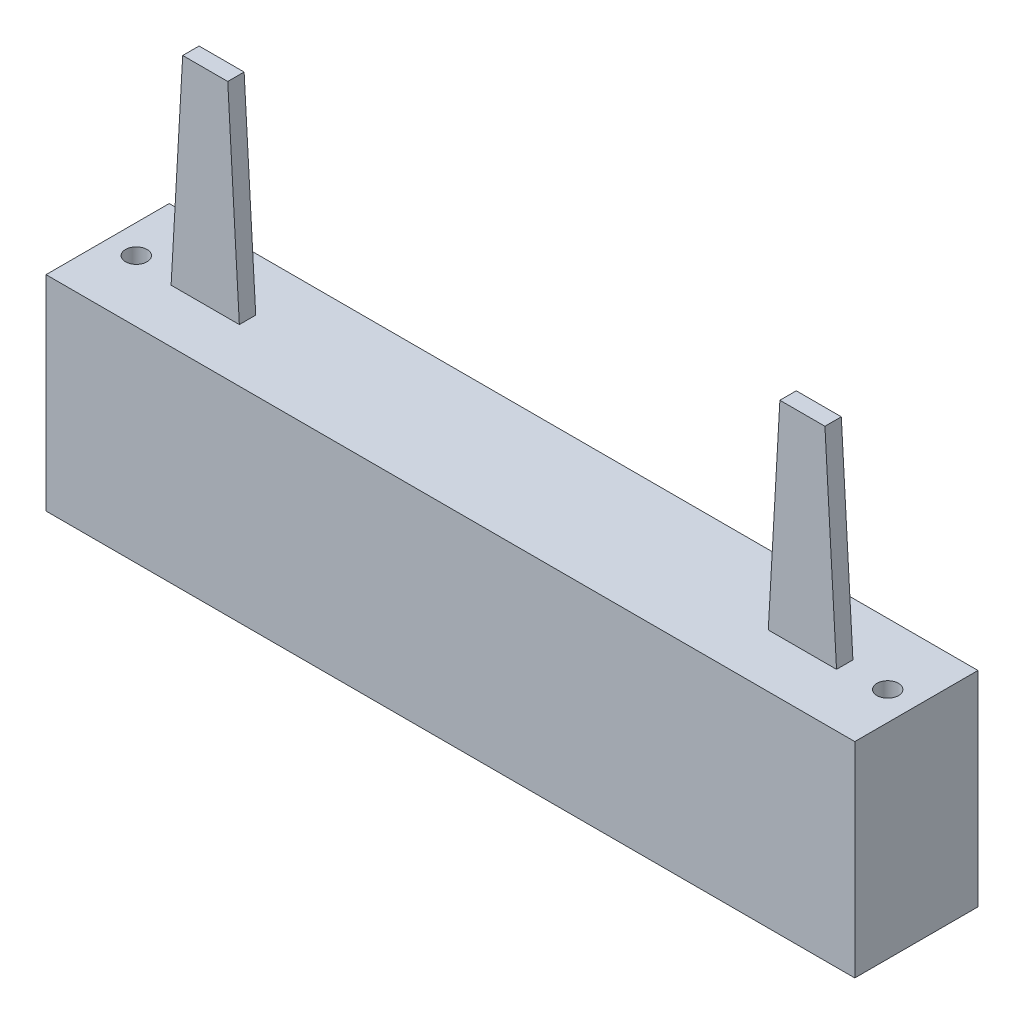
ISO-10303-21;
HEADER;
FILE_DESCRIPTION(('STEP AP214'),'2;1');
FILE_NAME('part.step','',(''),(''),'','','');
FILE_SCHEMA(('AUTOMOTIVE_DESIGN { 1 0 10303 214 1 1 1 1 }'));
ENDSEC;
DATA;
#1=APPLICATION_CONTEXT('core data for automotive mechanical design processes');
#2=APPLICATION_PROTOCOL_DEFINITION('international standard','automotive_design',2000,#1);
#3=PRODUCT_CONTEXT('',#1,'mechanical');
#4=PRODUCT('Part','Part','',(#3));
#5=PRODUCT_RELATED_PRODUCT_CATEGORY('part','',(#4));
#6=PRODUCT_DEFINITION_FORMATION('','',#4);
#7=PRODUCT_DEFINITION_CONTEXT('part definition',#1,'design');
#8=PRODUCT_DEFINITION('design','',#6,#7);
#9=PRODUCT_DEFINITION_SHAPE('','',#8);
#10=(LENGTH_UNIT() NAMED_UNIT(*) SI_UNIT(.MILLI.,.METRE.));
#11=(NAMED_UNIT(*) PLANE_ANGLE_UNIT() SI_UNIT($,.RADIAN.));
#12=(NAMED_UNIT(*) SI_UNIT($,.STERADIAN.) SOLID_ANGLE_UNIT());
#13=UNCERTAINTY_MEASURE_WITH_UNIT(LENGTH_MEASURE(1.E-05),#10,'distance_accuracy_value','');
#14=(GEOMETRIC_REPRESENTATION_CONTEXT(3) GLOBAL_UNCERTAINTY_ASSIGNED_CONTEXT((#13)) GLOBAL_UNIT_ASSIGNED_CONTEXT((#10,
#11,#12)) REPRESENTATION_CONTEXT('',''));
#15=CARTESIAN_POINT('',(0.,0.,0.));
#16=DIRECTION('',(0.,0.,1.));
#17=DIRECTION('',(1.,0.,0.));
#18=AXIS2_PLACEMENT_3D('',#15,#16,#17);
#19=CARTESIAN_POINT('',(0.,30.48,-5.1943));
#20=DIRECTION('',(0.,0.,-1.));
#21=DIRECTION('',(-1.,0.,0.));
#22=AXIS2_PLACEMENT_3D('',#19,#20,#21);
#23=PLANE('',#22);
#24=DIRECTION('',(0.0565759037142304,-0.998398300839359,0.));
#25=VECTOR('',#24,1.);
#26=CARTESIAN_POINT('',(55.7419090033116,-0.252511823145677,-5.1943));
#27=LINE('',#26,#25);
#28=CARTESIAN_POINT('',(54.0004,30.48,-5.1943));
#29=VERTEX_POINT('',#28);
#30=CARTESIAN_POINT('',(54.864,15.24,-5.1943));
#31=VERTEX_POINT('',#30);
#32=EDGE_CURVE('E63',#29,#31,#27,.T.);
#33=ORIENTED_EDGE('',*,*,#32,.T.);
#34=DIRECTION('',(1.,0.,0.));
#35=VECTOR('',#34,1.);
#36=CARTESIAN_POINT('',(0.,15.24,-5.1943));
#37=LINE('',#36,#35);
#38=CARTESIAN_POINT('',(49.784,15.24,-5.1943));
#39=VERTEX_POINT('',#38);
#40=EDGE_CURVE('E174',#39,#31,#37,.T.);
#41=ORIENTED_EDGE('',*,*,#40,.F.);
#42=DIRECTION('',(-0.0565759037142304,-0.998398300839359,0.));
#43=VECTOR('',#42,1.);
#44=CARTESIAN_POINT('',(48.9564977128997,0.637018462935685,-5.1943));
#45=LINE('',#44,#43);
#46=CARTESIAN_POINT('',(50.6476,30.48,-5.1943));
#47=VERTEX_POINT('',#46);
#48=EDGE_CURVE('E154',#47,#39,#45,.T.);
#49=ORIENTED_EDGE('',*,*,#48,.F.);
#50=DIRECTION('',(1.,0.,0.));
#51=VECTOR('',#50,1.);
#52=CARTESIAN_POINT('',(0.,30.48,-5.1943));
#53=LINE('',#52,#51);
#54=EDGE_CURVE('E180',#47,#29,#53,.T.);
#55=ORIENTED_EDGE('',*,*,#54,.T.);
#56=EDGE_LOOP('',(#33,#41,#49,#55));
#57=FACE_BOUND('',#56,.T.);
#58=ADVANCED_FACE('F40',(#57),#23,.T.);
#59=CARTESIAN_POINT('',(0.,30.48,-3.9751));
#60=DIRECTION('',(0.,0.,-1.));
#61=DIRECTION('',(-1.,0.,0.));
#62=AXIS2_PLACEMENT_3D('',#59,#60,#61);
#63=PLANE('',#62);
#64=DIRECTION('',(1.,0.,0.));
#65=VECTOR('',#64,1.);
#66=CARTESIAN_POINT('',(0.,15.24,-3.9751));
#67=LINE('',#66,#65);
#68=CARTESIAN_POINT('',(49.784,15.24,-3.9751));
#69=VERTEX_POINT('',#68);
#70=CARTESIAN_POINT('',(54.864,15.24,-3.9751));
#71=VERTEX_POINT('',#70);
#72=EDGE_CURVE('E192',#69,#71,#67,.T.);
#73=ORIENTED_EDGE('',*,*,#72,.T.);
#74=DIRECTION('',(0.0565759037142304,-0.998398300839359,0.));
#75=VECTOR('',#74,1.);
#76=CARTESIAN_POINT('',(55.7419090033116,-0.252511823145677,-3.9751));
#77=LINE('',#76,#75);
#78=CARTESIAN_POINT('',(54.0004,30.48,-3.9751));
#79=VERTEX_POINT('',#78);
#80=EDGE_CURVE('E156',#79,#71,#77,.T.);
#81=ORIENTED_EDGE('',*,*,#80,.F.);
#82=DIRECTION('',(1.,0.,0.));
#83=VECTOR('',#82,1.);
#84=CARTESIAN_POINT('',(0.,30.48,-3.9751));
#85=LINE('',#84,#83);
#86=CARTESIAN_POINT('',(50.6476,30.48,-3.9751));
#87=VERTEX_POINT('',#86);
#88=EDGE_CURVE('E183',#87,#79,#85,.T.);
#89=ORIENTED_EDGE('',*,*,#88,.F.);
#90=DIRECTION('',(-0.0565759037142304,-0.998398300839359,0.));
#91=VECTOR('',#90,1.);
#92=CARTESIAN_POINT('',(48.9564977128997,0.637018462935685,-3.9751));
#93=LINE('',#92,#91);
#94=EDGE_CURVE('E55',#87,#69,#93,.T.);
#95=ORIENTED_EDGE('',*,*,#94,.T.);
#96=EDGE_LOOP('',(#73,#81,#89,#95));
#97=FACE_BOUND('',#96,.T.);
#98=ADVANCED_FACE('F266',(#97),#63,.F.);
#99=CARTESIAN_POINT('',(0.,30.48,0.));
#100=DIRECTION('',(0.,1.,0.));
#101=DIRECTION('',(0.,0.,1.));
#102=AXIS2_PLACEMENT_3D('',#99,#100,#101);
#103=PLANE('',#102);
#104=DIRECTION('',(0.,0.,1.));
#105=VECTOR('',#104,1.);
#106=CARTESIAN_POINT('',(54.0004,30.48,-9.1704));
#107=LINE('',#106,#105);
#108=EDGE_CURVE('E159',#29,#79,#107,.T.);
#109=ORIENTED_EDGE('',*,*,#108,.F.);
#110=ORIENTED_EDGE('',*,*,#54,.F.);
#111=DIRECTION('',(0.,0.,1.));
#112=VECTOR('',#111,1.);
#113=CARTESIAN_POINT('',(50.6476,30.48,-9.1704));
#114=LINE('',#113,#112);
#115=EDGE_CURVE('E157',#47,#87,#114,.T.);
#116=ORIENTED_EDGE('',*,*,#115,.T.);
#117=ORIENTED_EDGE('',*,*,#88,.T.);
#118=EDGE_LOOP('',(#109,#110,#116,#117));
#119=FACE_BOUND('',#118,.T.);
#120=ADVANCED_FACE('F272',(#119),#103,.T.);
#121=CARTESIAN_POINT('',(0.,30.48,-5.1943));
#122=DIRECTION('',(0.,0.,-1.));
#123=DIRECTION('',(-1.,0.,0.));
#124=AXIS2_PLACEMENT_3D('',#121,#122,#123);
#125=PLANE('',#124);
#126=DIRECTION('',(1.,0.,0.));
#127=VECTOR('',#126,1.);
#128=CARTESIAN_POINT('',(0.,15.24,-5.1943));
#129=LINE('',#128,#127);
#130=CARTESIAN_POINT('',(5.334,15.24,-5.1943));
#131=VERTEX_POINT('',#130);
#132=CARTESIAN_POINT('',(10.414,15.24,-5.1943));
#133=VERTEX_POINT('',#132);
#134=EDGE_CURVE('E207',#131,#133,#129,.T.);
#135=ORIENTED_EDGE('',*,*,#134,.F.);
#136=DIRECTION('',(-0.0565759037142304,-0.998398300839359,0.));
#137=VECTOR('',#136,1.);
#138=CARTESIAN_POINT('',(4.45609099668841,-0.252511823145677,-5.1943));
#139=LINE('',#138,#137);
#140=CARTESIAN_POINT('',(6.1976,30.48,-5.1943));
#141=VERTEX_POINT('',#140);
#142=EDGE_CURVE('E165',#141,#131,#139,.T.);
#143=ORIENTED_EDGE('',*,*,#142,.F.);
#144=DIRECTION('',(1.,0.,0.));
#145=VECTOR('',#144,1.);
#146=CARTESIAN_POINT('',(0.,30.48,-5.1943));
#147=LINE('',#146,#145);
#148=CARTESIAN_POINT('',(9.5504,30.48,-5.1943));
#149=VERTEX_POINT('',#148);
#150=EDGE_CURVE('E197',#141,#149,#147,.T.);
#151=ORIENTED_EDGE('',*,*,#150,.T.);
#152=DIRECTION('',(0.0565759037142304,-0.998398300839359,0.));
#153=VECTOR('',#152,1.);
#154=CARTESIAN_POINT('',(11.2415022871003,0.637018462935685,-5.1943));
#155=LINE('',#154,#153);
#156=EDGE_CURVE('E168',#149,#133,#155,.T.);
#157=ORIENTED_EDGE('',*,*,#156,.T.);
#158=EDGE_LOOP('',(#135,#143,#151,#157));
#159=FACE_BOUND('',#158,.T.);
#160=ADVANCED_FACE('F283',(#159),#125,.T.);
#161=CARTESIAN_POINT('',(0.,30.48,-3.9751));
#162=DIRECTION('',(0.,0.,-1.));
#163=DIRECTION('',(-1.,0.,0.));
#164=AXIS2_PLACEMENT_3D('',#161,#162,#163);
#165=PLANE('',#164);
#166=DIRECTION('',(-0.0565759037142304,-0.998398300839359,0.));
#167=VECTOR('',#166,1.);
#168=CARTESIAN_POINT('',(4.45609099668841,-0.252511823145677,-3.9751));
#169=LINE('',#168,#167);
#170=CARTESIAN_POINT('',(6.1976,30.48,-3.9751));
#171=VERTEX_POINT('',#170);
#172=CARTESIAN_POINT('',(5.334,15.24,-3.9751));
#173=VERTEX_POINT('',#172);
#174=EDGE_CURVE('E167',#171,#173,#169,.T.);
#175=ORIENTED_EDGE('',*,*,#174,.T.);
#176=DIRECTION('',(1.,0.,0.));
#177=VECTOR('',#176,1.);
#178=CARTESIAN_POINT('',(0.,15.24,-3.9751));
#179=LINE('',#178,#177);
#180=CARTESIAN_POINT('',(10.414,15.24,-3.9751));
#181=VERTEX_POINT('',#180);
#182=EDGE_CURVE('E201',#173,#181,#179,.T.);
#183=ORIENTED_EDGE('',*,*,#182,.T.);
#184=DIRECTION('',(0.0565759037142304,-0.998398300839359,0.));
#185=VECTOR('',#184,1.);
#186=CARTESIAN_POINT('',(11.2415022871003,0.637018462935685,-3.9751));
#187=LINE('',#186,#185);
#188=CARTESIAN_POINT('',(9.5504,30.48,-3.9751));
#189=VERTEX_POINT('',#188);
#190=EDGE_CURVE('E161',#189,#181,#187,.T.);
#191=ORIENTED_EDGE('',*,*,#190,.F.);
#192=DIRECTION('',(1.,0.,0.));
#193=VECTOR('',#192,1.);
#194=CARTESIAN_POINT('',(0.,30.48,-3.9751));
#195=LINE('',#194,#193);
#196=EDGE_CURVE('E200',#171,#189,#195,.T.);
#197=ORIENTED_EDGE('',*,*,#196,.F.);
#198=EDGE_LOOP('',(#175,#183,#191,#197));
#199=FACE_BOUND('',#198,.T.);
#200=ADVANCED_FACE('F279',(#199),#165,.F.);
#201=CARTESIAN_POINT('',(0.,30.48,0.));
#202=DIRECTION('',(0.,1.,0.));
#203=DIRECTION('',(0.,0.,1.));
#204=AXIS2_PLACEMENT_3D('',#201,#202,#203);
#205=PLANE('',#204);
#206=ORIENTED_EDGE('',*,*,#150,.F.);
#207=DIRECTION('',(0.,0.,1.));
#208=VECTOR('',#207,1.);
#209=CARTESIAN_POINT('',(6.1976,30.48,-9.1704));
#210=LINE('',#209,#208);
#211=EDGE_CURVE('E171',#141,#171,#210,.T.);
#212=ORIENTED_EDGE('',*,*,#211,.T.);
#213=ORIENTED_EDGE('',*,*,#196,.T.);
#214=DIRECTION('',(0.,0.,1.));
#215=VECTOR('',#214,1.);
#216=CARTESIAN_POINT('',(9.5504,30.48,-9.1704));
#217=LINE('',#216,#215);
#218=EDGE_CURVE('E176',#149,#189,#217,.T.);
#219=ORIENTED_EDGE('',*,*,#218,.F.);
#220=EDGE_LOOP('',(#206,#212,#213,#219));
#221=FACE_BOUND('',#220,.T.);
#222=ADVANCED_FACE('F264',(#221),#205,.T.);
#223=CARTESIAN_POINT('',(0.,15.24,0.));
#224=DIRECTION('',(1.,0.,0.));
#225=DIRECTION('',(0.,0.,-1.));
#226=AXIS2_PLACEMENT_3D('',#223,#224,#225);
#227=PLANE('',#226);
#228=DIRECTION('',(0.,0.,1.));
#229=VECTOR('',#228,1.);
#230=CARTESIAN_POINT('',(0.,0.,0.));
#231=LINE('',#230,#229);
#232=CARTESIAN_POINT('',(0.,0.,-9.1694));
#233=VERTEX_POINT('',#232);
#234=CARTESIAN_POINT('',(0.,0.,0.));
#235=VERTEX_POINT('',#234);
#236=EDGE_CURVE('E204',#233,#235,#231,.T.);
#237=ORIENTED_EDGE('',*,*,#236,.T.);
#238=DIRECTION('',(0.,-1.,0.));
#239=VECTOR('',#238,1.);
#240=CARTESIAN_POINT('',(0.,15.24,0.));
#241=LINE('',#240,#239);
#242=CARTESIAN_POINT('',(0.,15.24,0.));
#243=VERTEX_POINT('',#242);
#244=EDGE_CURVE('E11',#243,#235,#241,.T.);
#245=ORIENTED_EDGE('',*,*,#244,.F.);
#246=DIRECTION('',(0.,0.,1.));
#247=VECTOR('',#246,1.);
#248=CARTESIAN_POINT('',(0.,15.24,0.));
#249=LINE('',#248,#247);
#250=CARTESIAN_POINT('',(0.,15.24,-9.1694));
#251=VERTEX_POINT('',#250);
#252=EDGE_CURVE('E214',#251,#243,#249,.T.);
#253=ORIENTED_EDGE('',*,*,#252,.F.);
#254=DIRECTION('',(0.,-1.,0.));
#255=VECTOR('',#254,1.);
#256=CARTESIAN_POINT('',(0.,15.24,-9.1694));
#257=LINE('',#256,#255);
#258=EDGE_CURVE('E224',#251,#233,#257,.T.);
#259=ORIENTED_EDGE('',*,*,#258,.T.);
#260=EDGE_LOOP('',(#237,#245,#253,#259));
#261=FACE_BOUND('',#260,.T.);
#262=ADVANCED_FACE('F42',(#261),#227,.F.);
#263=CARTESIAN_POINT('',(0.,15.24,0.));
#264=DIRECTION('',(0.,0.,-1.));
#265=DIRECTION('',(-1.,0.,0.));
#266=AXIS2_PLACEMENT_3D('',#263,#264,#265);
#267=PLANE('',#266);
#268=DIRECTION('',(1.,0.,0.));
#269=VECTOR('',#268,1.);
#270=CARTESIAN_POINT('',(0.,0.,0.));
#271=LINE('',#270,#269);
#272=CARTESIAN_POINT('',(60.198,0.,0.));
#273=VERTEX_POINT('',#272);
#274=EDGE_CURVE('E227',#235,#273,#271,.T.);
#275=ORIENTED_EDGE('',*,*,#274,.T.);
#276=DIRECTION('',(0.,-1.,0.));
#277=VECTOR('',#276,1.);
#278=CARTESIAN_POINT('',(60.198,15.24,0.));
#279=LINE('',#278,#277);
#280=CARTESIAN_POINT('',(60.198,15.24,0.));
#281=VERTEX_POINT('',#280);
#282=EDGE_CURVE('E48',#281,#273,#279,.T.);
#283=ORIENTED_EDGE('',*,*,#282,.F.);
#284=DIRECTION('',(1.,0.,0.));
#285=VECTOR('',#284,1.);
#286=CARTESIAN_POINT('',(0.,15.24,0.));
#287=LINE('',#286,#285);
#288=EDGE_CURVE('E217',#243,#281,#287,.T.);
#289=ORIENTED_EDGE('',*,*,#288,.F.);
#290=ORIENTED_EDGE('',*,*,#244,.T.);
#291=EDGE_LOOP('',(#275,#283,#289,#290));
#292=FACE_BOUND('',#291,.T.);
#293=ADVANCED_FACE('F257',(#292),#267,.F.);
#294=CARTESIAN_POINT('',(60.198,15.24,0.));
#295=DIRECTION('',(-1.,0.,0.));
#296=DIRECTION('',(0.,0.,1.));
#297=AXIS2_PLACEMENT_3D('',#294,#295,#296);
#298=PLANE('',#297);
#299=DIRECTION('',(0.,0.,-1.));
#300=VECTOR('',#299,1.);
#301=CARTESIAN_POINT('',(60.198,0.,0.));
#302=LINE('',#301,#300);
#303=CARTESIAN_POINT('',(60.198,0.,-9.1694));
#304=VERTEX_POINT('',#303);
#305=EDGE_CURVE('E229',#273,#304,#302,.T.);
#306=ORIENTED_EDGE('',*,*,#305,.T.);
#307=DIRECTION('',(0.,-1.,0.));
#308=VECTOR('',#307,1.);
#309=CARTESIAN_POINT('',(60.198,15.24,-9.1694));
#310=LINE('',#309,#308);
#311=CARTESIAN_POINT('',(60.198,15.24,-9.1694));
#312=VERTEX_POINT('',#311);
#313=EDGE_CURVE('E234',#312,#304,#310,.T.);
#314=ORIENTED_EDGE('',*,*,#313,.F.);
#315=DIRECTION('',(0.,0.,-1.));
#316=VECTOR('',#315,1.);
#317=CARTESIAN_POINT('',(60.198,15.24,0.));
#318=LINE('',#317,#316);
#319=EDGE_CURVE('E220',#281,#312,#318,.T.);
#320=ORIENTED_EDGE('',*,*,#319,.F.);
#321=ORIENTED_EDGE('',*,*,#282,.T.);
#322=EDGE_LOOP('',(#306,#314,#320,#321));
#323=FACE_BOUND('',#322,.T.);
#324=ADVANCED_FACE('F241',(#323),#298,.F.);
#325=CARTESIAN_POINT('',(0.,15.24,-9.1694));
#326=DIRECTION('',(0.,0.,1.));
#327=DIRECTION('',(1.,0.,0.));
#328=AXIS2_PLACEMENT_3D('',#325,#326,#327);
#329=PLANE('',#328);
#330=DIRECTION('',(-1.,0.,0.));
#331=VECTOR('',#330,1.);
#332=CARTESIAN_POINT('',(0.,0.,-9.1694));
#333=LINE('',#332,#331);
#334=EDGE_CURVE('E218',#304,#233,#333,.T.);
#335=ORIENTED_EDGE('',*,*,#334,.T.);
#336=ORIENTED_EDGE('',*,*,#258,.F.);
#337=DIRECTION('',(-1.,0.,0.));
#338=VECTOR('',#337,1.);
#339=CARTESIAN_POINT('',(0.,15.24,-9.1694));
#340=LINE('',#339,#338);
#341=EDGE_CURVE('E222',#312,#251,#340,.T.);
#342=ORIENTED_EDGE('',*,*,#341,.F.);
#343=ORIENTED_EDGE('',*,*,#313,.T.);
#344=EDGE_LOOP('',(#335,#336,#342,#343));
#345=FACE_BOUND('',#344,.T.);
#346=ADVANCED_FACE('F250',(#345),#329,.F.);
#347=CARTESIAN_POINT('',(0.,15.24,0.));
#348=DIRECTION('',(0.,-1.,0.));
#349=DIRECTION('',(0.,0.,-1.));
#350=AXIS2_PLACEMENT_3D('',#347,#348,#349);
#351=PLANE('',#350);
#352=CARTESIAN_POINT('',(2.1336,15.24,-4.5847));
#353=DIRECTION('',(0.,1.,0.));
#354=DIRECTION('',(0.,0.,1.));
#355=AXIS2_PLACEMENT_3D('',#352,#353,#354);
#356=CIRCLE('',#355,0.79999999999999);
#357=CARTESIAN_POINT('',(2.1336,15.24,-3.78470000000001));
#358=VERTEX_POINT('',#357);
#359=EDGE_CURVE('E144',#358,#358,#356,.T.);
#360=ORIENTED_EDGE('',*,*,#359,.F.);
#361=EDGE_LOOP('',(#360));
#362=FACE_BOUND('',#361,.T.);
#363=CARTESIAN_POINT('',(58.0644,15.24,-4.58470000000001));
#364=DIRECTION('',(0.,1.,0.));
#365=DIRECTION('',(0.,0.,1.));
#366=AXIS2_PLACEMENT_3D('',#363,#364,#365);
#367=CIRCLE('',#366,0.799999999999988);
#368=CARTESIAN_POINT('',(58.0644,15.24,-3.78470000000002));
#369=VERTEX_POINT('',#368);
#370=EDGE_CURVE('E143',#369,#369,#367,.T.);
#371=ORIENTED_EDGE('',*,*,#370,.F.);
#372=EDGE_LOOP('',(#371));
#373=FACE_BOUND('',#372,.T.);
#374=DIRECTION('',(0.,0.,1.));
#375=VECTOR('',#374,1.);
#376=CARTESIAN_POINT('',(49.784,15.24,0.));
#377=LINE('',#376,#375);
#378=EDGE_CURVE('E190',#39,#69,#377,.T.);
#379=ORIENTED_EDGE('',*,*,#378,.F.);
#380=ORIENTED_EDGE('',*,*,#40,.T.);
#381=DIRECTION('',(0.,0.,1.));
#382=VECTOR('',#381,1.);
#383=CARTESIAN_POINT('',(54.864,15.24,0.));
#384=LINE('',#383,#382);
#385=EDGE_CURVE('E184',#31,#71,#384,.T.);
#386=ORIENTED_EDGE('',*,*,#385,.T.);
#387=ORIENTED_EDGE('',*,*,#72,.F.);
#388=EDGE_LOOP('',(#379,#380,#386,#387));
#389=FACE_BOUND('',#388,.T.);
#390=ORIENTED_EDGE('',*,*,#134,.T.);
#391=DIRECTION('',(0.,0.,1.));
#392=VECTOR('',#391,1.);
#393=CARTESIAN_POINT('',(10.414,15.24,0.));
#394=LINE('',#393,#392);
#395=EDGE_CURVE('E187',#133,#181,#394,.T.);
#396=ORIENTED_EDGE('',*,*,#395,.T.);
#397=ORIENTED_EDGE('',*,*,#182,.F.);
#398=DIRECTION('',(0.,0.,1.));
#399=VECTOR('',#398,1.);
#400=CARTESIAN_POINT('',(5.334,15.24,0.));
#401=LINE('',#400,#399);
#402=EDGE_CURVE('E210',#131,#173,#401,.T.);
#403=ORIENTED_EDGE('',*,*,#402,.F.);
#404=EDGE_LOOP('',(#390,#396,#397,#403));
#405=FACE_BOUND('',#404,.T.);
#406=ORIENTED_EDGE('',*,*,#252,.T.);
#407=ORIENTED_EDGE('',*,*,#288,.T.);
#408=ORIENTED_EDGE('',*,*,#319,.T.);
#409=ORIENTED_EDGE('',*,*,#341,.T.);
#410=EDGE_LOOP('',(#406,#407,#408,#409));
#411=FACE_BOUND('',#410,.T.);
#412=ADVANCED_FACE('F256',(#362,#373,#389,#405,#411),#351,.F.);
#413=CARTESIAN_POINT('',(0.,0.,0.));
#414=DIRECTION('',(0.,-1.,0.));
#415=DIRECTION('',(0.,0.,-1.));
#416=AXIS2_PLACEMENT_3D('',#413,#414,#415);
#417=PLANE('',#416);
#418=ORIENTED_EDGE('',*,*,#236,.F.);
#419=ORIENTED_EDGE('',*,*,#334,.F.);
#420=ORIENTED_EDGE('',*,*,#305,.F.);
#421=ORIENTED_EDGE('',*,*,#274,.F.);
#422=EDGE_LOOP('',(#418,#419,#420,#421));
#423=FACE_BOUND('',#422,.T.);
#424=ADVANCED_FACE('F247',(#423),#417,.T.);
#425=CARTESIAN_POINT('',(11.2415022871003,0.637018462935685,-9.1704));
#426=DIRECTION('',(-0.998398300839358,-0.0565759037142304,0.));
#427=DIRECTION('',(0.0565759037142304,-0.998398300839359,0.));
#428=AXIS2_PLACEMENT_3D('',#425,#426,#427);
#429=PLANE('',#428);
#430=ORIENTED_EDGE('',*,*,#218,.T.);
#431=ORIENTED_EDGE('',*,*,#190,.T.);
#432=ORIENTED_EDGE('',*,*,#395,.F.);
#433=ORIENTED_EDGE('',*,*,#156,.F.);
#434=EDGE_LOOP('',(#430,#431,#432,#433));
#435=FACE_BOUND('',#434,.T.);
#436=ADVANCED_FACE('F293',(#435),#429,.F.);
#437=CARTESIAN_POINT('',(4.45609099668841,-0.252511823145677,-9.1704));
#438=DIRECTION('',(-0.998398300839358,0.0565759037142304,0.));
#439=DIRECTION('',(-0.0565759037142304,-0.998398300839359,0.));
#440=AXIS2_PLACEMENT_3D('',#437,#438,#439);
#441=PLANE('',#440);
#442=ORIENTED_EDGE('',*,*,#142,.T.);
#443=ORIENTED_EDGE('',*,*,#402,.T.);
#444=ORIENTED_EDGE('',*,*,#174,.F.);
#445=ORIENTED_EDGE('',*,*,#211,.F.);
#446=EDGE_LOOP('',(#442,#443,#444,#445));
#447=FACE_BOUND('',#446,.T.);
#448=ADVANCED_FACE('F316',(#447),#441,.T.);
#449=CARTESIAN_POINT('',(48.9564977128997,0.637018462935685,-9.1704));
#450=DIRECTION('',(-0.998398300839358,0.0565759037142304,0.));
#451=DIRECTION('',(-0.0565759037142304,-0.998398300839359,0.));
#452=AXIS2_PLACEMENT_3D('',#449,#450,#451);
#453=PLANE('',#452);
#454=ORIENTED_EDGE('',*,*,#48,.T.);
#455=ORIENTED_EDGE('',*,*,#378,.T.);
#456=ORIENTED_EDGE('',*,*,#94,.F.);
#457=ORIENTED_EDGE('',*,*,#115,.F.);
#458=EDGE_LOOP('',(#454,#455,#456,#457));
#459=FACE_BOUND('',#458,.T.);
#460=ADVANCED_FACE('F325',(#459),#453,.T.);
#461=CARTESIAN_POINT('',(55.7419090033116,-0.252511823145677,-9.1704));
#462=DIRECTION('',(-0.998398300839358,-0.0565759037142304,0.));
#463=DIRECTION('',(0.0565759037142304,-0.998398300839359,0.));
#464=AXIS2_PLACEMENT_3D('',#461,#462,#463);
#465=PLANE('',#464);
#466=ORIENTED_EDGE('',*,*,#108,.T.);
#467=ORIENTED_EDGE('',*,*,#80,.T.);
#468=ORIENTED_EDGE('',*,*,#385,.F.);
#469=ORIENTED_EDGE('',*,*,#32,.F.);
#470=EDGE_LOOP('',(#466,#467,#468,#469));
#471=FACE_BOUND('',#470,.T.);
#472=ADVANCED_FACE('F333',(#471),#465,.F.);
#473=CARTESIAN_POINT('',(58.0644,12.672688495222,-4.58470000000001));
#474=DIRECTION('',(0.,1.,0.));
#475=DIRECTION('',(0.,0.,1.));
#476=AXIS2_PLACEMENT_3D('',#473,#474,#475);
#477=CONICAL_SURFACE('',#476,0.800000000000002,1.02974425867665);
#478=CARTESIAN_POINT('',(58.0644,12.192,-4.58470000000001));
#479=VERTEX_POINT('',#478);
#480=VERTEX_LOOP('',#479);
#481=FACE_BOUND('',#480,.T.);
#482=CARTESIAN_POINT('',(58.0644,12.672688495222,-4.58470000000001));
#483=DIRECTION('',(0.,1.,0.));
#484=DIRECTION('',(0.,0.,1.));
#485=AXIS2_PLACEMENT_3D('',#482,#483,#484);
#486=CIRCLE('',#485,0.800000000000002);
#487=CARTESIAN_POINT('',(58.0644,12.672688495222,-3.7847));
#488=VERTEX_POINT('',#487);
#489=EDGE_CURVE('E147',#488,#488,#486,.T.);
#490=ORIENTED_EDGE('',*,*,#489,.T.);
#491=EDGE_LOOP('',(#490));
#492=FACE_BOUND('',#491,.T.);
#493=ADVANCED_FACE('F340',(#481,#492),#477,.F.);
#494=CARTESIAN_POINT('',(58.0644,15.24,-4.58470000000001));
#495=DIRECTION('',(0.,1.,0.));
#496=DIRECTION('',(0.,0.,1.));
#497=AXIS2_PLACEMENT_3D('',#494,#495,#496);
#498=CYLINDRICAL_SURFACE('',#497,0.799999999999995);
#499=ORIENTED_EDGE('',*,*,#489,.F.);
#500=EDGE_LOOP('',(#499));
#501=FACE_BOUND('',#500,.T.);
#502=ORIENTED_EDGE('',*,*,#370,.T.);
#503=EDGE_LOOP('',(#502));
#504=FACE_BOUND('',#503,.T.);
#505=ADVANCED_FACE('F137',(#501,#504),#498,.F.);
#506=CARTESIAN_POINT('',(2.1336,12.672688495222,-4.5847));
#507=DIRECTION('',(0.,1.,0.));
#508=DIRECTION('',(0.,0.,1.));
#509=AXIS2_PLACEMENT_3D('',#506,#507,#508);
#510=CONICAL_SURFACE('',#509,0.799999999999999,1.02974425867665);
#511=CARTESIAN_POINT('',(2.1336,12.192,-4.5847));
#512=VERTEX_POINT('',#511);
#513=VERTEX_LOOP('',#512);
#514=FACE_BOUND('',#513,.T.);
#515=CARTESIAN_POINT('',(2.1336,12.672688495222,-4.5847));
#516=DIRECTION('',(0.,1.,0.));
#517=DIRECTION('',(0.,0.,1.));
#518=AXIS2_PLACEMENT_3D('',#515,#516,#517);
#519=CIRCLE('',#518,0.799999999999999);
#520=CARTESIAN_POINT('',(2.1336,12.672688495222,-3.7847));
#521=VERTEX_POINT('',#520);
#522=EDGE_CURVE('E141',#521,#521,#519,.T.);
#523=ORIENTED_EDGE('',*,*,#522,.T.);
#524=EDGE_LOOP('',(#523));
#525=FACE_BOUND('',#524,.T.);
#526=ADVANCED_FACE('F133',(#514,#525),#510,.F.);
#527=CARTESIAN_POINT('',(2.1336,15.24,-4.5847));
#528=DIRECTION('',(0.,1.,0.));
#529=DIRECTION('',(0.,0.,1.));
#530=AXIS2_PLACEMENT_3D('',#527,#528,#529);
#531=CYLINDRICAL_SURFACE('',#530,0.799999999999995);
#532=ORIENTED_EDGE('',*,*,#522,.F.);
#533=EDGE_LOOP('',(#532));
#534=FACE_BOUND('',#533,.T.);
#535=ORIENTED_EDGE('',*,*,#359,.T.);
#536=EDGE_LOOP('',(#535));
#537=FACE_BOUND('',#536,.T.);
#538=ADVANCED_FACE('F136',(#534,#537),#531,.F.);
#539=CLOSED_SHELL('',(#58,#98,#120,#160,#200,#222,#262,#293,#324,#346,#412,#424,#436,#448,#460,
#472,#493,#505,#526,#538));
#540=MANIFOLD_SOLID_BREP('B2',#539);
#541=ADVANCED_BREP_SHAPE_REPRESENTATION('',(#18,#540),#14);
#542=SHAPE_DEFINITION_REPRESENTATION(#9,#541);
ENDSEC;
END-ISO-10303-21;
